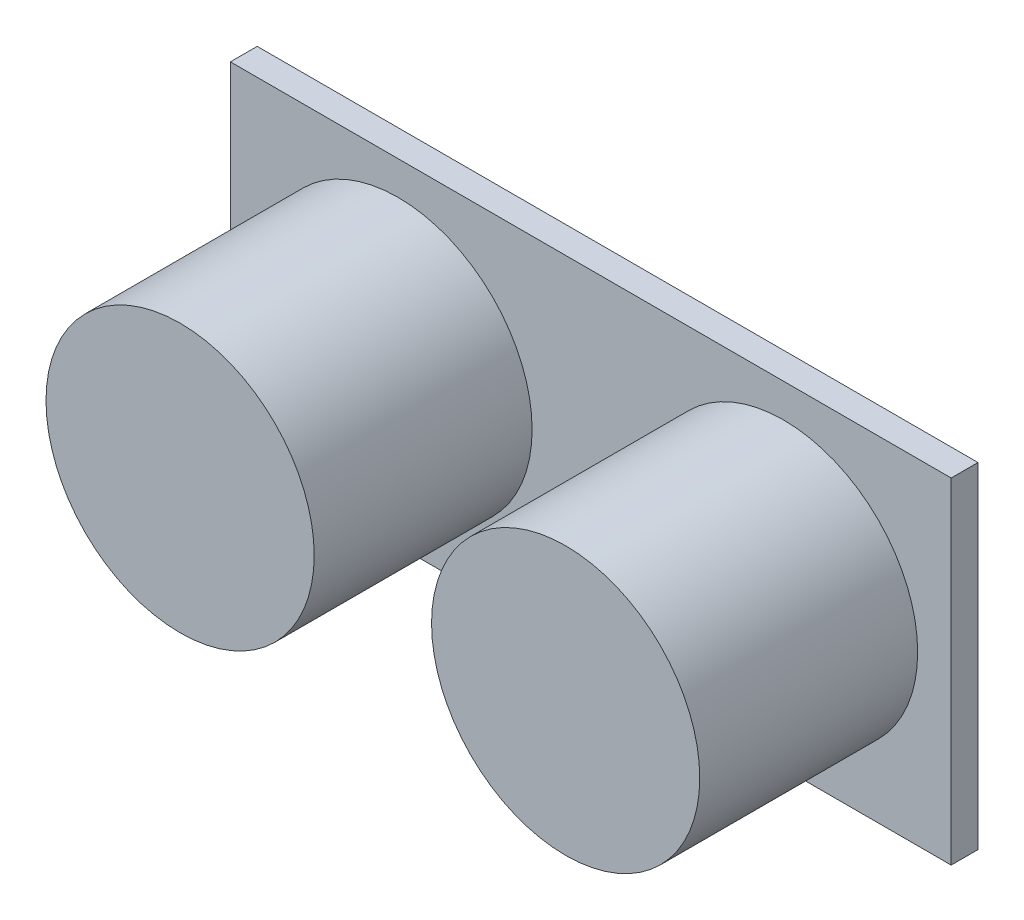
ISO-10303-21;
HEADER;
FILE_DESCRIPTION(('STEP AP214'),'2;1');
FILE_NAME('part.step','',(''),(''),'','','');
FILE_SCHEMA(('AUTOMOTIVE_DESIGN { 1 0 10303 214 1 1 1 1 }'));
ENDSEC;
DATA;
#1=APPLICATION_CONTEXT('core data for automotive mechanical design processes');
#2=APPLICATION_PROTOCOL_DEFINITION('international standard','automotive_design',2000,#1);
#3=PRODUCT_CONTEXT('',#1,'mechanical');
#4=PRODUCT('Part','Part','',(#3));
#5=PRODUCT_RELATED_PRODUCT_CATEGORY('part','',(#4));
#6=PRODUCT_DEFINITION_FORMATION('','',#4);
#7=PRODUCT_DEFINITION_CONTEXT('part definition',#1,'design');
#8=PRODUCT_DEFINITION('design','',#6,#7);
#9=PRODUCT_DEFINITION_SHAPE('','',#8);
#10=(LENGTH_UNIT() NAMED_UNIT(*) SI_UNIT(.MILLI.,.METRE.));
#11=(NAMED_UNIT(*) PLANE_ANGLE_UNIT() SI_UNIT($,.RADIAN.));
#12=(NAMED_UNIT(*) SI_UNIT($,.STERADIAN.) SOLID_ANGLE_UNIT());
#13=UNCERTAINTY_MEASURE_WITH_UNIT(LENGTH_MEASURE(1.E-05),#10,'distance_accuracy_value','');
#14=(GEOMETRIC_REPRESENTATION_CONTEXT(3) GLOBAL_UNCERTAINTY_ASSIGNED_CONTEXT((#13)) GLOBAL_UNIT_ASSIGNED_CONTEXT((#10,
#11,#12)) REPRESENTATION_CONTEXT('',''));
#15=CARTESIAN_POINT('',(0.,0.,0.));
#16=DIRECTION('',(0.,0.,1.));
#17=DIRECTION('',(1.,0.,0.));
#18=AXIS2_PLACEMENT_3D('',#15,#16,#17);
#19=CARTESIAN_POINT('',(21.5,-10.,1.6));
#20=DIRECTION('',(-1.,0.,0.));
#21=DIRECTION('',(0.,0.,1.));
#22=AXIS2_PLACEMENT_3D('',#19,#20,#21);
#23=PLANE('',#22);
#24=DIRECTION('',(0.,1.,0.));
#25=VECTOR('',#24,1.);
#26=CARTESIAN_POINT('',(21.5,-10.,0.));
#27=LINE('',#26,#25);
#28=CARTESIAN_POINT('',(21.5,-10.,0.));
#29=VERTEX_POINT('',#28);
#30=CARTESIAN_POINT('',(21.5,10.,0.));
#31=VERTEX_POINT('',#30);
#32=EDGE_CURVE('E100',#29,#31,#27,.T.);
#33=ORIENTED_EDGE('',*,*,#32,.T.);
#34=DIRECTION('',(0.,0.,-1.));
#35=VECTOR('',#34,1.);
#36=CARTESIAN_POINT('',(21.5,10.,1.6));
#37=LINE('',#36,#35);
#38=CARTESIAN_POINT('',(21.5,10.,1.6));
#39=VERTEX_POINT('',#38);
#40=EDGE_CURVE('E91',#39,#31,#37,.T.);
#41=ORIENTED_EDGE('',*,*,#40,.F.);
#42=DIRECTION('',(0.,1.,0.));
#43=VECTOR('',#42,1.);
#44=CARTESIAN_POINT('',(21.5,-10.,1.6));
#45=LINE('',#44,#43);
#46=CARTESIAN_POINT('',(21.5,-10.,1.6));
#47=VERTEX_POINT('',#46);
#48=EDGE_CURVE('E85',#47,#39,#45,.T.);
#49=ORIENTED_EDGE('',*,*,#48,.F.);
#50=DIRECTION('',(0.,0.,-1.));
#51=VECTOR('',#50,1.);
#52=CARTESIAN_POINT('',(21.5,-10.,1.6));
#53=LINE('',#52,#51);
#54=EDGE_CURVE('E96',#47,#29,#53,.T.);
#55=ORIENTED_EDGE('',*,*,#54,.T.);
#56=EDGE_LOOP('',(#33,#41,#49,#55));
#57=FACE_BOUND('',#56,.T.);
#58=ADVANCED_FACE('F33',(#57),#23,.F.);
#59=CARTESIAN_POINT('',(-21.5,10.,1.6));
#60=DIRECTION('',(0.,-1.,0.));
#61=DIRECTION('',(0.,0.,-1.));
#62=AXIS2_PLACEMENT_3D('',#59,#60,#61);
#63=PLANE('',#62);
#64=DIRECTION('',(-1.,0.,0.));
#65=VECTOR('',#64,1.);
#66=CARTESIAN_POINT('',(-21.5,10.,0.));
#67=LINE('',#66,#65);
#68=CARTESIAN_POINT('',(-21.5,10.,0.));
#69=VERTEX_POINT('',#68);
#70=EDGE_CURVE('E90',#31,#69,#67,.T.);
#71=ORIENTED_EDGE('',*,*,#70,.T.);
#72=DIRECTION('',(0.,0.,-1.));
#73=VECTOR('',#72,1.);
#74=CARTESIAN_POINT('',(-21.5,10.,1.6));
#75=LINE('',#74,#73);
#76=CARTESIAN_POINT('',(-21.5,10.,1.6));
#77=VERTEX_POINT('',#76);
#78=EDGE_CURVE('E88',#77,#69,#75,.T.);
#79=ORIENTED_EDGE('',*,*,#78,.F.);
#80=DIRECTION('',(-1.,0.,0.));
#81=VECTOR('',#80,1.);
#82=CARTESIAN_POINT('',(-21.5,10.,1.6));
#83=LINE('',#82,#81);
#84=EDGE_CURVE('E80',#39,#77,#83,.T.);
#85=ORIENTED_EDGE('',*,*,#84,.F.);
#86=ORIENTED_EDGE('',*,*,#40,.T.);
#87=EDGE_LOOP('',(#71,#79,#85,#86));
#88=FACE_BOUND('',#87,.T.);
#89=ADVANCED_FACE('F89',(#88),#63,.F.);
#90=CARTESIAN_POINT('',(-21.5,-10.,1.6));
#91=DIRECTION('',(1.,0.,0.));
#92=DIRECTION('',(0.,0.,-1.));
#93=AXIS2_PLACEMENT_3D('',#90,#91,#92);
#94=PLANE('',#93);
#95=DIRECTION('',(0.,-1.,0.));
#96=VECTOR('',#95,1.);
#97=CARTESIAN_POINT('',(-21.5,-10.,0.));
#98=LINE('',#97,#96);
#99=CARTESIAN_POINT('',(-21.5,-10.,0.));
#100=VERTEX_POINT('',#99);
#101=EDGE_CURVE('E66',#69,#100,#98,.T.);
#102=ORIENTED_EDGE('',*,*,#101,.T.);
#103=DIRECTION('',(0.,0.,-1.));
#104=VECTOR('',#103,1.);
#105=CARTESIAN_POINT('',(-21.5,-10.,1.6));
#106=LINE('',#105,#104);
#107=CARTESIAN_POINT('',(-21.5,-10.,1.6));
#108=VERTEX_POINT('',#107);
#109=EDGE_CURVE('E92',#108,#100,#106,.T.);
#110=ORIENTED_EDGE('',*,*,#109,.F.);
#111=DIRECTION('',(0.,-1.,0.));
#112=VECTOR('',#111,1.);
#113=CARTESIAN_POINT('',(-21.5,-10.,1.6));
#114=LINE('',#113,#112);
#115=EDGE_CURVE('E83',#77,#108,#114,.T.);
#116=ORIENTED_EDGE('',*,*,#115,.F.);
#117=ORIENTED_EDGE('',*,*,#78,.T.);
#118=EDGE_LOOP('',(#102,#110,#116,#117));
#119=FACE_BOUND('',#118,.T.);
#120=ADVANCED_FACE('F94',(#119),#94,.F.);
#121=CARTESIAN_POINT('',(-21.5,-10.,1.6));
#122=DIRECTION('',(0.,1.,0.));
#123=DIRECTION('',(0.,0.,1.));
#124=AXIS2_PLACEMENT_3D('',#121,#122,#123);
#125=PLANE('',#124);
#126=DIRECTION('',(1.,0.,0.));
#127=VECTOR('',#126,1.);
#128=CARTESIAN_POINT('',(-21.5,-10.,0.));
#129=LINE('',#128,#127);
#130=EDGE_CURVE('E72',#100,#29,#129,.T.);
#131=ORIENTED_EDGE('',*,*,#130,.T.);
#132=ORIENTED_EDGE('',*,*,#54,.F.);
#133=DIRECTION('',(1.,0.,0.));
#134=VECTOR('',#133,1.);
#135=CARTESIAN_POINT('',(-21.5,-10.,1.6));
#136=LINE('',#135,#134);
#137=EDGE_CURVE('E49',#108,#47,#136,.T.);
#138=ORIENTED_EDGE('',*,*,#137,.F.);
#139=ORIENTED_EDGE('',*,*,#109,.T.);
#140=EDGE_LOOP('',(#131,#132,#138,#139));
#141=FACE_BOUND('',#140,.T.);
#142=ADVANCED_FACE('F116',(#141),#125,.F.);
#143=CARTESIAN_POINT('',(0.,0.,1.6));
#144=DIRECTION('',(0.,0.,-1.));
#145=DIRECTION('',(-1.,0.,0.));
#146=AXIS2_PLACEMENT_3D('',#143,#144,#145);
#147=PLANE('',#146);
#148=CARTESIAN_POINT('',(11.5,0.,1.6));
#149=DIRECTION('',(0.,0.,-1.));
#150=DIRECTION('',(-1.,0.,0.));
#151=AXIS2_PLACEMENT_3D('',#148,#149,#150);
#152=CIRCLE('',#151,8.);
#153=CARTESIAN_POINT('',(3.5,0.,1.6));
#154=VERTEX_POINT('',#153);
#155=EDGE_CURVE('E11',#154,#154,#152,.F.);
#156=ORIENTED_EDGE('',*,*,#155,.F.);
#157=EDGE_LOOP('',(#156));
#158=FACE_BOUND('',#157,.T.);
#159=CARTESIAN_POINT('',(-11.5,0.,1.6));
#160=DIRECTION('',(0.,0.,-1.));
#161=DIRECTION('',(-1.,0.,0.));
#162=AXIS2_PLACEMENT_3D('',#159,#160,#161);
#163=CIRCLE('',#162,8.);
#164=CARTESIAN_POINT('',(-19.5,0.,1.6));
#165=VERTEX_POINT('',#164);
#166=EDGE_CURVE('E41',#165,#165,#163,.F.);
#167=ORIENTED_EDGE('',*,*,#166,.F.);
#168=EDGE_LOOP('',(#167));
#169=FACE_BOUND('',#168,.T.);
#170=ORIENTED_EDGE('',*,*,#48,.T.);
#171=ORIENTED_EDGE('',*,*,#84,.T.);
#172=ORIENTED_EDGE('',*,*,#115,.T.);
#173=ORIENTED_EDGE('',*,*,#137,.T.);
#174=EDGE_LOOP('',(#170,#171,#172,#173));
#175=FACE_BOUND('',#174,.T.);
#176=ADVANCED_FACE('F81',(#158,#169,#175),#147,.F.);
#177=CARTESIAN_POINT('',(0.,0.,0.));
#178=DIRECTION('',(0.,0.,-1.));
#179=DIRECTION('',(-1.,0.,0.));
#180=AXIS2_PLACEMENT_3D('',#177,#178,#179);
#181=PLANE('',#180);
#182=ORIENTED_EDGE('',*,*,#32,.F.);
#183=ORIENTED_EDGE('',*,*,#130,.F.);
#184=ORIENTED_EDGE('',*,*,#101,.F.);
#185=ORIENTED_EDGE('',*,*,#70,.F.);
#186=EDGE_LOOP('',(#182,#183,#184,#185));
#187=FACE_BOUND('',#186,.T.);
#188=ADVANCED_FACE('F115',(#187),#181,.T.);
#189=CARTESIAN_POINT('',(-11.5,0.,14.6));
#190=DIRECTION('',(0.,0.,-1.));
#191=DIRECTION('',(-1.,0.,0.));
#192=AXIS2_PLACEMENT_3D('',#189,#190,#191);
#193=CYLINDRICAL_SURFACE('',#192,8.);
#194=CARTESIAN_POINT('',(-11.5,0.,14.6));
#195=DIRECTION('',(0.,0.,1.));
#196=DIRECTION('',(1.,0.,0.));
#197=AXIS2_PLACEMENT_3D('',#194,#195,#196);
#198=CIRCLE('',#197,8.);
#199=CARTESIAN_POINT('',(-19.5,0.,14.6));
#200=VERTEX_POINT('',#199);
#201=EDGE_CURVE('E103',#200,#200,#198,.T.);
#202=CARTESIAN_POINT('',(-19.5,0.,14.6));
#203=CARTESIAN_POINT('',(-19.5,0.,14.4645833333333));
#204=CARTESIAN_POINT('',(-19.5,0.,14.3291666666667));
#205=CARTESIAN_POINT('',(-19.5,0.,14.0583333333333));
#206=CARTESIAN_POINT('',(-19.5,0.,13.9229166666667));
#207=CARTESIAN_POINT('',(-19.5,0.,13.6520833333333));
#208=CARTESIAN_POINT('',(-19.5,0.,13.5166666666667));
#209=CARTESIAN_POINT('',(-19.5,0.,13.2458333333333));
#210=CARTESIAN_POINT('',(-19.5,0.,13.1104166666667));
#211=CARTESIAN_POINT('',(-19.5,0.,12.8395833333333));
#212=CARTESIAN_POINT('',(-19.5,0.,12.7041666666667));
#213=CARTESIAN_POINT('',(-19.5,0.,12.4333333333333));
#214=CARTESIAN_POINT('',(-19.5,0.,12.2979166666667));
#215=CARTESIAN_POINT('',(-19.5,0.,12.0270833333333));
#216=CARTESIAN_POINT('',(-19.5,0.,11.8916666666667));
#217=CARTESIAN_POINT('',(-19.5,0.,11.6208333333333));
#218=CARTESIAN_POINT('',(-19.5,0.,11.4854166666667));
#219=CARTESIAN_POINT('',(-19.5,0.,11.2145833333333));
#220=CARTESIAN_POINT('',(-19.5,0.,11.0791666666667));
#221=CARTESIAN_POINT('',(-19.5,0.,10.8083333333333));
#222=CARTESIAN_POINT('',(-19.5,0.,10.6729166666667));
#223=CARTESIAN_POINT('',(-19.5,0.,10.4020833333333));
#224=CARTESIAN_POINT('',(-19.5,0.,10.2666666666667));
#225=CARTESIAN_POINT('',(-19.5,0.,9.99583333333333));
#226=CARTESIAN_POINT('',(-19.5,0.,9.86041666666667));
#227=CARTESIAN_POINT('',(-19.5,0.,9.58958333333333));
#228=CARTESIAN_POINT('',(-19.5,0.,9.45416666666667));
#229=CARTESIAN_POINT('',(-19.5,0.,9.18333333333333));
#230=CARTESIAN_POINT('',(-19.5,0.,9.04791666666667));
#231=CARTESIAN_POINT('',(-19.5,0.,8.77708333333333));
#232=CARTESIAN_POINT('',(-19.5,0.,8.64166666666667));
#233=CARTESIAN_POINT('',(-19.5,0.,8.37083333333333));
#234=CARTESIAN_POINT('',(-19.5,0.,8.23541666666667));
#235=CARTESIAN_POINT('',(-19.5,0.,7.96458333333333));
#236=CARTESIAN_POINT('',(-19.5,0.,7.82916666666667));
#237=CARTESIAN_POINT('',(-19.5,0.,7.55833333333333));
#238=CARTESIAN_POINT('',(-19.5,0.,7.42291666666667));
#239=CARTESIAN_POINT('',(-19.5,0.,7.15208333333333));
#240=CARTESIAN_POINT('',(-19.5,0.,7.01666666666667));
#241=CARTESIAN_POINT('',(-19.5,0.,6.74583333333333));
#242=CARTESIAN_POINT('',(-19.5,0.,6.61041666666667));
#243=CARTESIAN_POINT('',(-19.5,0.,6.33958333333334));
#244=CARTESIAN_POINT('',(-19.5,0.,6.20416666666667));
#245=CARTESIAN_POINT('',(-19.5,0.,5.93333333333333));
#246=CARTESIAN_POINT('',(-19.5,0.,5.79791666666667));
#247=CARTESIAN_POINT('',(-19.5,0.,5.52708333333333));
#248=CARTESIAN_POINT('',(-19.5,0.,5.39166666666667));
#249=CARTESIAN_POINT('',(-19.5,0.,5.12083333333333));
#250=CARTESIAN_POINT('',(-19.5,0.,4.98541666666667));
#251=CARTESIAN_POINT('',(-19.5,0.,4.71458333333333));
#252=CARTESIAN_POINT('',(-19.5,0.,4.57916666666667));
#253=CARTESIAN_POINT('',(-19.5,0.,4.30833333333334));
#254=CARTESIAN_POINT('',(-19.5,0.,4.17291666666667));
#255=CARTESIAN_POINT('',(-19.5,0.,3.90208333333333));
#256=CARTESIAN_POINT('',(-19.5,0.,3.76666666666667));
#257=CARTESIAN_POINT('',(-19.5,0.,3.49583333333333));
#258=CARTESIAN_POINT('',(-19.5,0.,3.36041666666667));
#259=CARTESIAN_POINT('',(-19.5,0.,3.08958333333333));
#260=CARTESIAN_POINT('',(-19.5,0.,2.95416666666667));
#261=CARTESIAN_POINT('',(-19.5,0.,2.68333333333333));
#262=CARTESIAN_POINT('',(-19.5,0.,2.54791666666667));
#263=CARTESIAN_POINT('',(-19.5,0.,2.27708333333333));
#264=CARTESIAN_POINT('',(-19.5,0.,2.14166666666667));
#265=CARTESIAN_POINT('',(-19.5,0.,1.87083333333333));
#266=CARTESIAN_POINT('',(-19.5,0.,1.73541666666667));
#267=CARTESIAN_POINT('',(-19.5,0.,1.6));
#268=B_SPLINE_CURVE_WITH_KNOTS('',3,(#202,#203,#204,#205,#206,#207,#208,#209,#210,#211,#212,
#213,#214,#215,#216,#217,#218,#219,#220,#221,#222,#223,#224,#225,#226,#227,#228,#229,#230,#231,
#232,#233,#234,#235,#236,#237,#238,#239,#240,#241,#242,#243,#244,#245,#246,#247,#248,#249,#250,
#251,#252,#253,#254,#255,#256,#257,#258,#259,#260,#261,#262,#263,#264,#265,#266,#267),
.UNSPECIFIED.,.F.,.F.,(4,2,2,2,2,2,2,2,2,2,2,2,2,2,2,2,2,2,2,2,2,2,2,2,2,2,2,2,2,2,2,2,4),(0.,
0.40625,0.812500000000001,1.21875,1.625,2.03125,2.4375,2.84375,3.25,3.65625,4.0625,4.46875,
4.875,5.28125,5.6875,6.09375,6.5,6.90625,7.3125,7.71875,8.125,8.53125,8.9375,9.34375,9.75,
10.15625,10.5625,10.96875,11.375,11.78125,12.1875,12.59375,13.),.UNSPECIFIED.);
#269=EDGE_CURVE('BSEAM112',#200,#165,#268,.T.);
#270=ORIENTED_EDGE('',*,*,#201,.F.);
#271=ORIENTED_EDGE('',*,*,#166,.T.);
#272=ORIENTED_EDGE('',*,*,#269,.T.);
#273=ORIENTED_EDGE('',*,*,#269,.F.);
#274=EDGE_LOOP('',(#270,#272,#271,#273));
#275=FACE_BOUND('',#274,.T.);
#276=ADVANCED_FACE('F112',(#275),#193,.T.);
#277=CARTESIAN_POINT('',(-11.5,0.,14.6));
#278=DIRECTION('',(0.,0.,1.));
#279=DIRECTION('',(1.,0.,0.));
#280=AXIS2_PLACEMENT_3D('',#277,#278,#279);
#281=PLANE('',#280);
#282=ORIENTED_EDGE('',*,*,#201,.T.);
#283=EDGE_LOOP('',(#282));
#284=FACE_BOUND('',#283,.T.);
#285=ADVANCED_FACE('F146',(#284),#281,.T.);
#286=CARTESIAN_POINT('',(11.5,0.,14.6));
#287=DIRECTION('',(0.,0.,-1.));
#288=DIRECTION('',(-1.,0.,0.));
#289=AXIS2_PLACEMENT_3D('',#286,#287,#288);
#290=CYLINDRICAL_SURFACE('',#289,8.);
#291=CARTESIAN_POINT('',(11.5,0.,14.6));
#292=DIRECTION('',(0.,0.,1.));
#293=DIRECTION('',(-1.,0.,0.));
#294=AXIS2_PLACEMENT_3D('',#291,#292,#293);
#295=CIRCLE('',#294,8.);
#296=CARTESIAN_POINT('',(3.5,0.,14.6));
#297=VERTEX_POINT('',#296);
#298=EDGE_CURVE('E137',#297,#297,#295,.T.);
#299=CARTESIAN_POINT('',(3.5,0.,14.6));
#300=CARTESIAN_POINT('',(3.5,0.,14.4645833333333));
#301=CARTESIAN_POINT('',(3.5,0.,14.3291666666667));
#302=CARTESIAN_POINT('',(3.5,0.,14.0583333333333));
#303=CARTESIAN_POINT('',(3.5,0.,13.9229166666667));
#304=CARTESIAN_POINT('',(3.5,0.,13.6520833333333));
#305=CARTESIAN_POINT('',(3.5,0.,13.5166666666667));
#306=CARTESIAN_POINT('',(3.5,0.,13.2458333333333));
#307=CARTESIAN_POINT('',(3.5,0.,13.1104166666667));
#308=CARTESIAN_POINT('',(3.5,0.,12.8395833333333));
#309=CARTESIAN_POINT('',(3.5,0.,12.7041666666667));
#310=CARTESIAN_POINT('',(3.5,0.,12.4333333333333));
#311=CARTESIAN_POINT('',(3.5,0.,12.2979166666667));
#312=CARTESIAN_POINT('',(3.5,0.,12.0270833333333));
#313=CARTESIAN_POINT('',(3.5,0.,11.8916666666667));
#314=CARTESIAN_POINT('',(3.5,0.,11.6208333333333));
#315=CARTESIAN_POINT('',(3.5,0.,11.4854166666667));
#316=CARTESIAN_POINT('',(3.5,0.,11.2145833333333));
#317=CARTESIAN_POINT('',(3.5,0.,11.0791666666667));
#318=CARTESIAN_POINT('',(3.5,0.,10.8083333333333));
#319=CARTESIAN_POINT('',(3.5,0.,10.6729166666667));
#320=CARTESIAN_POINT('',(3.5,0.,10.4020833333333));
#321=CARTESIAN_POINT('',(3.5,0.,10.2666666666667));
#322=CARTESIAN_POINT('',(3.5,0.,9.99583333333333));
#323=CARTESIAN_POINT('',(3.5,0.,9.86041666666667));
#324=CARTESIAN_POINT('',(3.5,0.,9.58958333333333));
#325=CARTESIAN_POINT('',(3.5,0.,9.45416666666667));
#326=CARTESIAN_POINT('',(3.5,0.,9.18333333333333));
#327=CARTESIAN_POINT('',(3.5,0.,9.04791666666667));
#328=CARTESIAN_POINT('',(3.5,0.,8.77708333333333));
#329=CARTESIAN_POINT('',(3.5,0.,8.64166666666667));
#330=CARTESIAN_POINT('',(3.5,0.,8.37083333333333));
#331=CARTESIAN_POINT('',(3.5,0.,8.23541666666667));
#332=CARTESIAN_POINT('',(3.5,0.,7.96458333333333));
#333=CARTESIAN_POINT('',(3.5,0.,7.82916666666667));
#334=CARTESIAN_POINT('',(3.5,0.,7.55833333333333));
#335=CARTESIAN_POINT('',(3.5,0.,7.42291666666667));
#336=CARTESIAN_POINT('',(3.5,0.,7.15208333333333));
#337=CARTESIAN_POINT('',(3.5,0.,7.01666666666667));
#338=CARTESIAN_POINT('',(3.5,0.,6.74583333333333));
#339=CARTESIAN_POINT('',(3.5,0.,6.61041666666667));
#340=CARTESIAN_POINT('',(3.5,0.,6.33958333333334));
#341=CARTESIAN_POINT('',(3.5,0.,6.20416666666667));
#342=CARTESIAN_POINT('',(3.5,0.,5.93333333333333));
#343=CARTESIAN_POINT('',(3.5,0.,5.79791666666667));
#344=CARTESIAN_POINT('',(3.5,0.,5.52708333333333));
#345=CARTESIAN_POINT('',(3.5,0.,5.39166666666667));
#346=CARTESIAN_POINT('',(3.5,0.,5.12083333333333));
#347=CARTESIAN_POINT('',(3.5,0.,4.98541666666667));
#348=CARTESIAN_POINT('',(3.5,0.,4.71458333333333));
#349=CARTESIAN_POINT('',(3.5,0.,4.57916666666667));
#350=CARTESIAN_POINT('',(3.5,0.,4.30833333333334));
#351=CARTESIAN_POINT('',(3.5,0.,4.17291666666667));
#352=CARTESIAN_POINT('',(3.5,0.,3.90208333333333));
#353=CARTESIAN_POINT('',(3.5,0.,3.76666666666667));
#354=CARTESIAN_POINT('',(3.5,0.,3.49583333333333));
#355=CARTESIAN_POINT('',(3.5,0.,3.36041666666667));
#356=CARTESIAN_POINT('',(3.5,0.,3.08958333333333));
#357=CARTESIAN_POINT('',(3.5,0.,2.95416666666667));
#358=CARTESIAN_POINT('',(3.5,0.,2.68333333333333));
#359=CARTESIAN_POINT('',(3.5,0.,2.54791666666667));
#360=CARTESIAN_POINT('',(3.5,0.,2.27708333333333));
#361=CARTESIAN_POINT('',(3.5,0.,2.14166666666667));
#362=CARTESIAN_POINT('',(3.5,0.,1.87083333333333));
#363=CARTESIAN_POINT('',(3.5,0.,1.73541666666667));
#364=CARTESIAN_POINT('',(3.5,0.,1.6));
#365=B_SPLINE_CURVE_WITH_KNOTS('',3,(#299,#300,#301,#302,#303,#304,#305,#306,#307,#308,#309,
#310,#311,#312,#313,#314,#315,#316,#317,#318,#319,#320,#321,#322,#323,#324,#325,#326,#327,#328,
#329,#330,#331,#332,#333,#334,#335,#336,#337,#338,#339,#340,#341,#342,#343,#344,#345,#346,#347,
#348,#349,#350,#351,#352,#353,#354,#355,#356,#357,#358,#359,#360,#361,#362,#363,#364),
.UNSPECIFIED.,.F.,.F.,(4,2,2,2,2,2,2,2,2,2,2,2,2,2,2,2,2,2,2,2,2,2,2,2,2,2,2,2,2,2,2,2,4),(0.,
0.40625,0.812500000000001,1.21875,1.625,2.03125,2.4375,2.84375,3.25,3.65625,4.0625,4.46875,
4.875,5.28125,5.6875,6.09375,6.5,6.90625,7.3125,7.71875,8.125,8.53125,8.9375,9.34375,9.75,
10.15625,10.5625,10.96875,11.375,11.78125,12.1875,12.59375,13.),.UNSPECIFIED.);
#366=EDGE_CURVE('BSEAM143',#297,#154,#365,.T.);
#367=ORIENTED_EDGE('',*,*,#298,.F.);
#368=ORIENTED_EDGE('',*,*,#155,.T.);
#369=ORIENTED_EDGE('',*,*,#366,.T.);
#370=ORIENTED_EDGE('',*,*,#366,.F.);
#371=EDGE_LOOP('',(#367,#369,#368,#370));
#372=FACE_BOUND('',#371,.T.);
#373=ADVANCED_FACE('F143',(#372),#290,.T.);
#374=CARTESIAN_POINT('',(11.5,0.,14.6));
#375=DIRECTION('',(0.,0.,-1.));
#376=DIRECTION('',(-1.,0.,0.));
#377=AXIS2_PLACEMENT_3D('',#374,#375,#376);
#378=PLANE('',#377);
#379=ORIENTED_EDGE('',*,*,#298,.T.);
#380=EDGE_LOOP('',(#379));
#381=FACE_BOUND('',#380,.T.);
#382=ADVANCED_FACE('F141',(#381),#378,.F.);
#383=CLOSED_SHELL('',(#58,#89,#120,#142,#176,#188,#276,#285,#373,#382));
#384=MANIFOLD_SOLID_BREP('B2',#383);
#385=ADVANCED_BREP_SHAPE_REPRESENTATION('',(#18,#384),#14);
#386=SHAPE_DEFINITION_REPRESENTATION(#9,#385);
ENDSEC;
END-ISO-10303-21;
